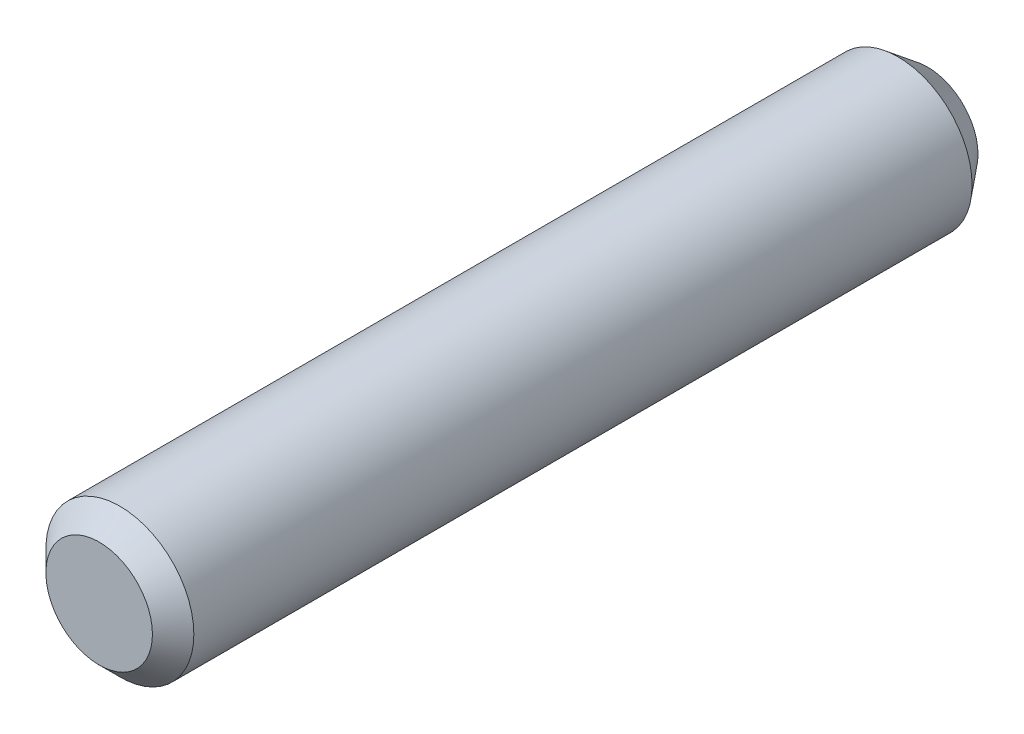
ISO-10303-21;
HEADER;
FILE_DESCRIPTION(('STEP AP214'),'2;1');
FILE_NAME('part.step','',(''),(''),'','','');
FILE_SCHEMA(('AUTOMOTIVE_DESIGN { 1 0 10303 214 1 1 1 1 }'));
ENDSEC;
DATA;
#1=APPLICATION_CONTEXT('core data for automotive mechanical design processes');
#2=APPLICATION_PROTOCOL_DEFINITION('international standard','automotive_design',2000,#1);
#3=PRODUCT_CONTEXT('',#1,'mechanical');
#4=PRODUCT('Part','Part','',(#3));
#5=PRODUCT_RELATED_PRODUCT_CATEGORY('part','',(#4));
#6=PRODUCT_DEFINITION_FORMATION('','',#4);
#7=PRODUCT_DEFINITION_CONTEXT('part definition',#1,'design');
#8=PRODUCT_DEFINITION('design','',#6,#7);
#9=PRODUCT_DEFINITION_SHAPE('','',#8);
#10=(LENGTH_UNIT() NAMED_UNIT(*) SI_UNIT(.MILLI.,.METRE.));
#11=(NAMED_UNIT(*) PLANE_ANGLE_UNIT() SI_UNIT($,.RADIAN.));
#12=(NAMED_UNIT(*) SI_UNIT($,.STERADIAN.) SOLID_ANGLE_UNIT());
#13=UNCERTAINTY_MEASURE_WITH_UNIT(LENGTH_MEASURE(1.E-05),#10,'distance_accuracy_value','');
#14=(GEOMETRIC_REPRESENTATION_CONTEXT(3) GLOBAL_UNCERTAINTY_ASSIGNED_CONTEXT((#13)) GLOBAL_UNIT_ASSIGNED_CONTEXT((#10,
#11,#12)) REPRESENTATION_CONTEXT('',''));
#15=CARTESIAN_POINT('',(0.,0.,0.));
#16=DIRECTION('',(0.,0.,1.));
#17=DIRECTION('',(1.,0.,0.));
#18=AXIS2_PLACEMENT_3D('',#15,#16,#17);
#19=CARTESIAN_POINT('',(0.,0.,14.));
#20=DIRECTION('',(0.,0.,-1.));
#21=DIRECTION('',(-1.,0.,0.));
#22=AXIS2_PLACEMENT_3D('',#19,#20,#21);
#23=CYLINDRICAL_SURFACE('',#22,1.25);
#24=CARTESIAN_POINT('',(0.,0.,0.499999999999999));
#25=DIRECTION('',(0.,0.,1.));
#26=DIRECTION('',(1.,0.,0.));
#27=AXIS2_PLACEMENT_3D('',#24,#25,#26);
#28=CIRCLE('',#27,1.25);
#29=CARTESIAN_POINT('',(1.25,0.,0.499999999999999));
#30=VERTEX_POINT('',#29);
#31=EDGE_CURVE('E54',#30,#30,#28,.T.);
#32=ORIENTED_EDGE('',*,*,#31,.T.);
#33=EDGE_LOOP('',(#32));
#34=FACE_BOUND('',#33,.T.);
#35=CARTESIAN_POINT('',(0.,0.,13.65));
#36=DIRECTION('',(0.,0.,1.));
#37=DIRECTION('',(1.,0.,0.));
#38=AXIS2_PLACEMENT_3D('',#35,#36,#37);
#39=CIRCLE('',#38,1.25);
#40=CARTESIAN_POINT('',(1.25,0.,13.65));
#41=VERTEX_POINT('',#40);
#42=EDGE_CURVE('E59',#41,#41,#39,.F.);
#43=ORIENTED_EDGE('',*,*,#42,.T.);
#44=EDGE_LOOP('',(#43));
#45=FACE_BOUND('',#44,.T.);
#46=ADVANCED_FACE('F45',(#34,#45),#23,.T.);
#47=CARTESIAN_POINT('',(0.,0.,14.));
#48=DIRECTION('',(0.,0.,1.));
#49=DIRECTION('',(1.,0.,0.));
#50=AXIS2_PLACEMENT_3D('',#47,#48,#49);
#51=PLANE('',#50);
#52=CARTESIAN_POINT('',(0.,0.,14.));
#53=DIRECTION('',(0.,0.,1.));
#54=DIRECTION('',(1.,0.,0.));
#55=AXIS2_PLACEMENT_3D('',#52,#53,#54);
#56=CIRCLE('',#55,0.900000000000003);
#57=CARTESIAN_POINT('',(0.900000000000003,0.,14.));
#58=VERTEX_POINT('',#57);
#59=EDGE_CURVE('E64',#58,#58,#56,.T.);
#60=ORIENTED_EDGE('',*,*,#59,.T.);
#61=EDGE_LOOP('',(#60));
#62=FACE_BOUND('',#61,.T.);
#63=ADVANCED_FACE('F71',(#62),#51,.T.);
#64=CARTESIAN_POINT('',(0.,0.,0.));
#65=DIRECTION('',(0.,0.,1.));
#66=DIRECTION('',(1.,0.,0.));
#67=AXIS2_PLACEMENT_3D('',#64,#65,#66);
#68=PLANE('',#67);
#69=CARTESIAN_POINT('',(0.,0.,0.));
#70=DIRECTION('',(0.,0.,1.));
#71=DIRECTION('',(1.,0.,0.));
#72=AXIS2_PLACEMENT_3D('',#69,#70,#71);
#73=CIRCLE('',#72,0.850000000000002);
#74=CARTESIAN_POINT('',(0.850000000000002,0.,0.));
#75=VERTEX_POINT('',#74);
#76=EDGE_CURVE('E10',#75,#75,#73,.F.);
#77=ORIENTED_EDGE('',*,*,#76,.T.);
#78=EDGE_LOOP('',(#77));
#79=FACE_BOUND('',#78,.T.);
#80=ADVANCED_FACE('F75',(#79),#68,.F.);
#81=CARTESIAN_POINT('',(0.,0.,14.));
#82=DIRECTION('',(0.,0.,-1.));
#83=DIRECTION('',(-1.,0.,0.));
#84=AXIS2_PLACEMENT_3D('',#81,#82,#83);
#85=CONICAL_SURFACE('',#84,0.900000000000003,0.785398163397447);
#86=ORIENTED_EDGE('',*,*,#42,.F.);
#87=EDGE_LOOP('',(#86));
#88=FACE_BOUND('',#87,.T.);
#89=ORIENTED_EDGE('',*,*,#59,.F.);
#90=EDGE_LOOP('',(#89));
#91=FACE_BOUND('',#90,.T.);
#92=ADVANCED_FACE('F73',(#88,#91),#85,.T.);
#93=CARTESIAN_POINT('',(0.,0.,0.499999999999999));
#94=DIRECTION('',(0.,0.,1.));
#95=DIRECTION('',(1.,0.,0.));
#96=AXIS2_PLACEMENT_3D('',#93,#94,#95);
#97=CONICAL_SURFACE('',#96,1.25,0.674740942223552);
#98=ORIENTED_EDGE('',*,*,#76,.F.);
#99=EDGE_LOOP('',(#98));
#100=FACE_BOUND('',#99,.T.);
#101=ORIENTED_EDGE('',*,*,#31,.F.);
#102=EDGE_LOOP('',(#101));
#103=FACE_BOUND('',#102,.T.);
#104=ADVANCED_FACE('F48',(#100,#103),#97,.T.);
#105=CLOSED_SHELL('',(#46,#63,#80,#92,#104));
#106=MANIFOLD_SOLID_BREP('B2',#105);
#107=ADVANCED_BREP_SHAPE_REPRESENTATION('',(#18,#106),#14);
#108=SHAPE_DEFINITION_REPRESENTATION(#9,#107);
ENDSEC;
END-ISO-10303-21;
